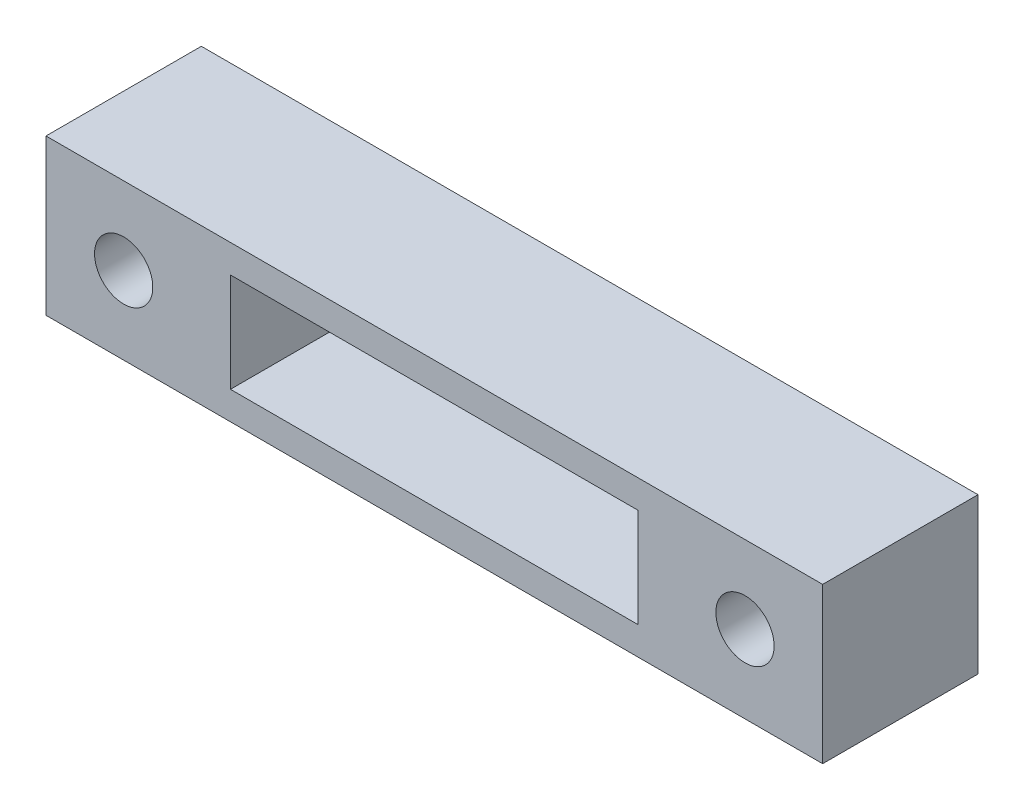
ISO-10303-21;
HEADER;
FILE_DESCRIPTION(('STEP AP214'),'2;1');
FILE_NAME('part.step','',(''),(''),'','','');
FILE_SCHEMA(('AUTOMOTIVE_DESIGN { 1 0 10303 214 1 1 1 1 }'));
ENDSEC;
DATA;
#1=APPLICATION_CONTEXT('core data for automotive mechanical design processes');
#2=APPLICATION_PROTOCOL_DEFINITION('international standard','automotive_design',2000,#1);
#3=PRODUCT_CONTEXT('',#1,'mechanical');
#4=PRODUCT('Part','Part','',(#3));
#5=PRODUCT_RELATED_PRODUCT_CATEGORY('part','',(#4));
#6=PRODUCT_DEFINITION_FORMATION('','',#4);
#7=PRODUCT_DEFINITION_CONTEXT('part definition',#1,'design');
#8=PRODUCT_DEFINITION('design','',#6,#7);
#9=PRODUCT_DEFINITION_SHAPE('','',#8);
#10=(LENGTH_UNIT() NAMED_UNIT(*) SI_UNIT(.MILLI.,.METRE.));
#11=(NAMED_UNIT(*) PLANE_ANGLE_UNIT() SI_UNIT($,.RADIAN.));
#12=(NAMED_UNIT(*) SI_UNIT($,.STERADIAN.) SOLID_ANGLE_UNIT());
#13=UNCERTAINTY_MEASURE_WITH_UNIT(LENGTH_MEASURE(1.E-05),#10,'distance_accuracy_value','');
#14=(GEOMETRIC_REPRESENTATION_CONTEXT(3) GLOBAL_UNCERTAINTY_ASSIGNED_CONTEXT((#13)) GLOBAL_UNIT_ASSIGNED_CONTEXT((#10,
#11,#12)) REPRESENTATION_CONTEXT('',''));
#15=CARTESIAN_POINT('',(0.,0.,0.));
#16=DIRECTION('',(0.,0.,1.));
#17=DIRECTION('',(1.,0.,0.));
#18=AXIS2_PLACEMENT_3D('',#15,#16,#17);
#19=CARTESIAN_POINT('',(-20.,8.,0.));
#20=DIRECTION('',(-1.,0.,0.));
#21=DIRECTION('',(0.,0.,1.));
#22=AXIS2_PLACEMENT_3D('',#19,#20,#21);
#23=PLANE('',#22);
#24=DIRECTION('',(0.,0.,-1.));
#25=VECTOR('',#24,1.);
#26=CARTESIAN_POINT('',(-20.,0.,0.));
#27=LINE('',#26,#25);
#28=CARTESIAN_POINT('',(-20.,0.,-12.));
#29=VERTEX_POINT('',#28);
#30=CARTESIAN_POINT('',(-20.,0.,-20.));
#31=VERTEX_POINT('',#30);
#32=EDGE_CURVE('E161',#29,#31,#27,.T.);
#33=ORIENTED_EDGE('',*,*,#32,.F.);
#34=DIRECTION('',(0.,-1.,0.));
#35=VECTOR('',#34,1.);
#36=CARTESIAN_POINT('',(-20.,8.,-12.));
#37=LINE('',#36,#35);
#38=CARTESIAN_POINT('',(-20.,8.,-12.));
#39=VERTEX_POINT('',#38);
#40=EDGE_CURVE('E11',#39,#29,#37,.T.);
#41=ORIENTED_EDGE('',*,*,#40,.F.);
#42=DIRECTION('',(0.,0.,-1.));
#43=VECTOR('',#42,1.);
#44=CARTESIAN_POINT('',(-20.,8.,0.));
#45=LINE('',#44,#43);
#46=CARTESIAN_POINT('',(-20.,8.,-20.));
#47=VERTEX_POINT('',#46);
#48=EDGE_CURVE('E167',#39,#47,#45,.T.);
#49=ORIENTED_EDGE('',*,*,#48,.T.);
#50=DIRECTION('',(0.,-1.,0.));
#51=VECTOR('',#50,1.);
#52=CARTESIAN_POINT('',(-20.,8.,-20.));
#53=LINE('',#52,#51);
#54=EDGE_CURVE('E69',#47,#31,#53,.T.);
#55=ORIENTED_EDGE('',*,*,#54,.T.);
#56=EDGE_LOOP('',(#33,#41,#49,#55));
#57=FACE_BOUND('',#56,.T.);
#58=ADVANCED_FACE('F45',(#57),#23,.T.);
#59=CARTESIAN_POINT('',(0.,8.,-12.));
#60=DIRECTION('',(0.,0.,-1.));
#61=DIRECTION('',(-1.,0.,0.));
#62=AXIS2_PLACEMENT_3D('',#59,#60,#61);
#63=PLANE('',#62);
#64=CARTESIAN_POINT('',(16.,4.,-12.));
#65=DIRECTION('',(0.,0.,-1.));
#66=DIRECTION('',(-1.,0.,0.));
#67=AXIS2_PLACEMENT_3D('',#64,#65,#66);
#68=CIRCLE('',#67,1.5);
#69=CARTESIAN_POINT('',(14.5,4.,-12.));
#70=VERTEX_POINT('',#69);
#71=EDGE_CURVE('E143',#70,#70,#68,.T.);
#72=ORIENTED_EDGE('',*,*,#71,.T.);
#73=EDGE_LOOP('',(#72));
#74=FACE_BOUND('',#73,.T.);
#75=CARTESIAN_POINT('',(-16.,4.,-12.));
#76=DIRECTION('',(0.,0.,-1.));
#77=DIRECTION('',(-1.,0.,0.));
#78=AXIS2_PLACEMENT_3D('',#75,#76,#77);
#79=CIRCLE('',#78,1.5);
#80=CARTESIAN_POINT('',(-17.5,4.,-12.));
#81=VERTEX_POINT('',#80);
#82=EDGE_CURVE('E260',#81,#81,#79,.T.);
#83=ORIENTED_EDGE('',*,*,#82,.T.);
#84=EDGE_LOOP('',(#83));
#85=FACE_BOUND('',#84,.T.);
#86=DIRECTION('',(0.,1.,0.));
#87=VECTOR('',#86,1.);
#88=CARTESIAN_POINT('',(10.5,1.45,-12.));
#89=LINE('',#88,#87);
#90=CARTESIAN_POINT('',(10.5,1.45,-12.));
#91=VERTEX_POINT('',#90);
#92=CARTESIAN_POINT('',(10.5,6.55,-12.));
#93=VERTEX_POINT('',#92);
#94=EDGE_CURVE('E152',#91,#93,#89,.T.);
#95=ORIENTED_EDGE('',*,*,#94,.F.);
#96=DIRECTION('',(1.,0.,0.));
#97=VECTOR('',#96,1.);
#98=CARTESIAN_POINT('',(-10.5,1.45,-12.));
#99=LINE('',#98,#97);
#100=CARTESIAN_POINT('',(-10.5,1.45,-12.));
#101=VERTEX_POINT('',#100);
#102=EDGE_CURVE('E60',#101,#91,#99,.T.);
#103=ORIENTED_EDGE('',*,*,#102,.F.);
#104=DIRECTION('',(0.,1.,0.));
#105=VECTOR('',#104,1.);
#106=CARTESIAN_POINT('',(-10.5,1.45,-12.));
#107=LINE('',#106,#105);
#108=CARTESIAN_POINT('',(-10.5,6.55,-12.));
#109=VERTEX_POINT('',#108);
#110=EDGE_CURVE('E136',#101,#109,#107,.T.);
#111=ORIENTED_EDGE('',*,*,#110,.T.);
#112=DIRECTION('',(1.,0.,0.));
#113=VECTOR('',#112,1.);
#114=CARTESIAN_POINT('',(-10.5,6.55,-12.));
#115=LINE('',#114,#113);
#116=EDGE_CURVE('E140',#109,#93,#115,.T.);
#117=ORIENTED_EDGE('',*,*,#116,.T.);
#118=EDGE_LOOP('',(#95,#103,#111,#117));
#119=FACE_BOUND('',#118,.T.);
#120=DIRECTION('',(1.,0.,0.));
#121=VECTOR('',#120,1.);
#122=CARTESIAN_POINT('',(0.,0.,-12.));
#123=LINE('',#122,#121);
#124=CARTESIAN_POINT('',(20.,0.,-12.));
#125=VERTEX_POINT('',#124);
#126=EDGE_CURVE('E182',#29,#125,#123,.T.);
#127=ORIENTED_EDGE('',*,*,#126,.T.);
#128=DIRECTION('',(0.,-1.,0.));
#129=VECTOR('',#128,1.);
#130=CARTESIAN_POINT('',(20.,8.,-12.));
#131=LINE('',#130,#129);
#132=CARTESIAN_POINT('',(20.,8.,-12.));
#133=VERTEX_POINT('',#132);
#134=EDGE_CURVE('E53',#133,#125,#131,.T.);
#135=ORIENTED_EDGE('',*,*,#134,.F.);
#136=DIRECTION('',(1.,0.,0.));
#137=VECTOR('',#136,1.);
#138=CARTESIAN_POINT('',(0.,8.,-12.));
#139=LINE('',#138,#137);
#140=EDGE_CURVE('E170',#39,#133,#139,.T.);
#141=ORIENTED_EDGE('',*,*,#140,.F.);
#142=ORIENTED_EDGE('',*,*,#40,.T.);
#143=EDGE_LOOP('',(#127,#135,#141,#142));
#144=FACE_BOUND('',#143,.T.);
#145=ADVANCED_FACE('F213',(#74,#85,#119,#144),#63,.F.);
#146=CARTESIAN_POINT('',(20.,8.,0.));
#147=DIRECTION('',(-1.,0.,0.));
#148=DIRECTION('',(0.,0.,1.));
#149=AXIS2_PLACEMENT_3D('',#146,#147,#148);
#150=PLANE('',#149);
#151=DIRECTION('',(0.,0.,-1.));
#152=VECTOR('',#151,1.);
#153=CARTESIAN_POINT('',(20.,0.,0.));
#154=LINE('',#153,#152);
#155=CARTESIAN_POINT('',(20.,0.,-20.));
#156=VERTEX_POINT('',#155);
#157=EDGE_CURVE('E185',#125,#156,#154,.T.);
#158=ORIENTED_EDGE('',*,*,#157,.T.);
#159=DIRECTION('',(0.,-1.,0.));
#160=VECTOR('',#159,1.);
#161=CARTESIAN_POINT('',(20.,8.,-20.));
#162=LINE('',#161,#160);
#163=CARTESIAN_POINT('',(20.,8.,-20.));
#164=VERTEX_POINT('',#163);
#165=EDGE_CURVE('E194',#164,#156,#162,.T.);
#166=ORIENTED_EDGE('',*,*,#165,.F.);
#167=DIRECTION('',(0.,0.,-1.));
#168=VECTOR('',#167,1.);
#169=CARTESIAN_POINT('',(20.,8.,0.));
#170=LINE('',#169,#168);
#171=EDGE_CURVE('E174',#133,#164,#170,.T.);
#172=ORIENTED_EDGE('',*,*,#171,.F.);
#173=ORIENTED_EDGE('',*,*,#134,.T.);
#174=EDGE_LOOP('',(#158,#166,#172,#173));
#175=FACE_BOUND('',#174,.T.);
#176=ADVANCED_FACE('F202',(#175),#150,.F.);
#177=CARTESIAN_POINT('',(0.,8.,-20.));
#178=DIRECTION('',(0.,0.,-1.));
#179=DIRECTION('',(-1.,0.,0.));
#180=AXIS2_PLACEMENT_3D('',#177,#178,#179);
#181=PLANE('',#180);
#182=CARTESIAN_POINT('',(16.,4.,-20.));
#183=DIRECTION('',(0.,0.,-1.));
#184=DIRECTION('',(-1.,0.,0.));
#185=AXIS2_PLACEMENT_3D('',#182,#183,#184);
#186=CIRCLE('',#185,1.5);
#187=CARTESIAN_POINT('',(14.5,4.,-20.));
#188=VERTEX_POINT('',#187);
#189=EDGE_CURVE('E257',#188,#188,#186,.T.);
#190=ORIENTED_EDGE('',*,*,#189,.F.);
#191=EDGE_LOOP('',(#190));
#192=FACE_BOUND('',#191,.T.);
#193=CARTESIAN_POINT('',(-16.,4.,-20.));
#194=DIRECTION('',(0.,0.,-1.));
#195=DIRECTION('',(1.,0.,0.));
#196=AXIS2_PLACEMENT_3D('',#193,#194,#195);
#197=CIRCLE('',#196,1.5);
#198=CARTESIAN_POINT('',(-14.5,4.,-20.));
#199=VERTEX_POINT('',#198);
#200=EDGE_CURVE('E265',#199,#199,#197,.T.);
#201=ORIENTED_EDGE('',*,*,#200,.F.);
#202=EDGE_LOOP('',(#201));
#203=FACE_BOUND('',#202,.T.);
#204=DIRECTION('',(1.,0.,0.));
#205=VECTOR('',#204,1.);
#206=CARTESIAN_POINT('',(0.,0.,-20.));
#207=LINE('',#206,#205);
#208=EDGE_CURVE('E171',#31,#156,#207,.T.);
#209=ORIENTED_EDGE('',*,*,#208,.F.);
#210=ORIENTED_EDGE('',*,*,#54,.F.);
#211=DIRECTION('',(1.,0.,0.));
#212=VECTOR('',#211,1.);
#213=CARTESIAN_POINT('',(0.,8.,-20.));
#214=LINE('',#213,#212);
#215=EDGE_CURVE('E177',#47,#164,#214,.T.);
#216=ORIENTED_EDGE('',*,*,#215,.T.);
#217=ORIENTED_EDGE('',*,*,#165,.T.);
#218=EDGE_LOOP('',(#209,#210,#216,#217));
#219=FACE_BOUND('',#218,.T.);
#220=ADVANCED_FACE('F208',(#192,#203,#219),#181,.T.);
#221=CARTESIAN_POINT('',(0.,8.,0.));
#222=DIRECTION('',(0.,1.,0.));
#223=DIRECTION('',(0.,0.,1.));
#224=AXIS2_PLACEMENT_3D('',#221,#222,#223);
#225=PLANE('',#224);
#226=ORIENTED_EDGE('',*,*,#48,.F.);
#227=ORIENTED_EDGE('',*,*,#140,.T.);
#228=ORIENTED_EDGE('',*,*,#171,.T.);
#229=ORIENTED_EDGE('',*,*,#215,.F.);
#230=EDGE_LOOP('',(#226,#227,#228,#229));
#231=FACE_BOUND('',#230,.T.);
#232=ADVANCED_FACE('F212',(#231),#225,.T.);
#233=CARTESIAN_POINT('',(0.,0.,0.));
#234=DIRECTION('',(0.,1.,0.));
#235=DIRECTION('',(0.,0.,1.));
#236=AXIS2_PLACEMENT_3D('',#233,#234,#235);
#237=PLANE('',#236);
#238=ORIENTED_EDGE('',*,*,#32,.T.);
#239=ORIENTED_EDGE('',*,*,#208,.T.);
#240=ORIENTED_EDGE('',*,*,#157,.F.);
#241=ORIENTED_EDGE('',*,*,#126,.F.);
#242=EDGE_LOOP('',(#238,#239,#240,#241));
#243=FACE_BOUND('',#242,.T.);
#244=ADVANCED_FACE('F207',(#243),#237,.F.);
#245=CARTESIAN_POINT('',(-10.5,1.45,-17.5));
#246=DIRECTION('',(0.,-1.,0.));
#247=DIRECTION('',(0.,0.,-1.));
#248=AXIS2_PLACEMENT_3D('',#245,#246,#247);
#249=PLANE('',#248);
#250=ORIENTED_EDGE('',*,*,#102,.T.);
#251=DIRECTION('',(0.,0.,1.));
#252=VECTOR('',#251,1.);
#253=CARTESIAN_POINT('',(10.5,1.45,-17.5));
#254=LINE('',#253,#252);
#255=CARTESIAN_POINT('',(10.5,1.45,-17.5));
#256=VERTEX_POINT('',#255);
#257=EDGE_CURVE('E112',#256,#91,#254,.T.);
#258=ORIENTED_EDGE('',*,*,#257,.F.);
#259=DIRECTION('',(1.,0.,0.));
#260=VECTOR('',#259,1.);
#261=CARTESIAN_POINT('',(-10.5,1.45,-17.5));
#262=LINE('',#261,#260);
#263=CARTESIAN_POINT('',(-10.5,1.45,-17.5));
#264=VERTEX_POINT('',#263);
#265=EDGE_CURVE('E116',#264,#256,#262,.T.);
#266=ORIENTED_EDGE('',*,*,#265,.F.);
#267=DIRECTION('',(0.,0.,1.));
#268=VECTOR('',#267,1.);
#269=CARTESIAN_POINT('',(-10.5,1.45,-17.5));
#270=LINE('',#269,#268);
#271=EDGE_CURVE('E158',#264,#101,#270,.T.);
#272=ORIENTED_EDGE('',*,*,#271,.T.);
#273=EDGE_LOOP('',(#250,#258,#266,#272));
#274=FACE_BOUND('',#273,.T.);
#275=ADVANCED_FACE('F114',(#274),#249,.F.);
#276=CARTESIAN_POINT('',(-10.5,1.45,-17.5));
#277=DIRECTION('',(1.,0.,0.));
#278=DIRECTION('',(0.,0.,-1.));
#279=AXIS2_PLACEMENT_3D('',#276,#277,#278);
#280=PLANE('',#279);
#281=ORIENTED_EDGE('',*,*,#110,.F.);
#282=ORIENTED_EDGE('',*,*,#271,.F.);
#283=DIRECTION('',(0.,1.,0.));
#284=VECTOR('',#283,1.);
#285=CARTESIAN_POINT('',(-10.5,1.45,-17.5));
#286=LINE('',#285,#284);
#287=CARTESIAN_POINT('',(-10.5,6.55,-17.5));
#288=VERTEX_POINT('',#287);
#289=EDGE_CURVE('E122',#264,#288,#286,.T.);
#290=ORIENTED_EDGE('',*,*,#289,.T.);
#291=DIRECTION('',(0.,0.,1.));
#292=VECTOR('',#291,1.);
#293=CARTESIAN_POINT('',(-10.5,6.55,-17.5));
#294=LINE('',#293,#292);
#295=EDGE_CURVE('E162',#288,#109,#294,.T.);
#296=ORIENTED_EDGE('',*,*,#295,.T.);
#297=EDGE_LOOP('',(#281,#282,#290,#296));
#298=FACE_BOUND('',#297,.T.);
#299=ADVANCED_FACE('F234',(#298),#280,.T.);
#300=CARTESIAN_POINT('',(-10.5,6.55,-17.5));
#301=DIRECTION('',(0.,-1.,0.));
#302=DIRECTION('',(0.,0.,-1.));
#303=AXIS2_PLACEMENT_3D('',#300,#301,#302);
#304=PLANE('',#303);
#305=ORIENTED_EDGE('',*,*,#116,.F.);
#306=ORIENTED_EDGE('',*,*,#295,.F.);
#307=DIRECTION('',(1.,0.,0.));
#308=VECTOR('',#307,1.);
#309=CARTESIAN_POINT('',(-10.5,6.55,-17.5));
#310=LINE('',#309,#308);
#311=CARTESIAN_POINT('',(10.5,6.55,-17.5));
#312=VERTEX_POINT('',#311);
#313=EDGE_CURVE('E131',#288,#312,#310,.T.);
#314=ORIENTED_EDGE('',*,*,#313,.T.);
#315=DIRECTION('',(0.,0.,1.));
#316=VECTOR('',#315,1.);
#317=CARTESIAN_POINT('',(10.5,6.55,-17.5));
#318=LINE('',#317,#316);
#319=EDGE_CURVE('E121',#312,#93,#318,.T.);
#320=ORIENTED_EDGE('',*,*,#319,.T.);
#321=EDGE_LOOP('',(#305,#306,#314,#320));
#322=FACE_BOUND('',#321,.T.);
#323=ADVANCED_FACE('F237',(#322),#304,.T.);
#324=CARTESIAN_POINT('',(10.5,1.45,-17.5));
#325=DIRECTION('',(1.,0.,0.));
#326=DIRECTION('',(0.,0.,-1.));
#327=AXIS2_PLACEMENT_3D('',#324,#325,#326);
#328=PLANE('',#327);
#329=ORIENTED_EDGE('',*,*,#94,.T.);
#330=ORIENTED_EDGE('',*,*,#319,.F.);
#331=DIRECTION('',(0.,1.,0.));
#332=VECTOR('',#331,1.);
#333=CARTESIAN_POINT('',(10.5,1.45,-17.5));
#334=LINE('',#333,#332);
#335=EDGE_CURVE('E126',#256,#312,#334,.T.);
#336=ORIENTED_EDGE('',*,*,#335,.F.);
#337=ORIENTED_EDGE('',*,*,#257,.T.);
#338=EDGE_LOOP('',(#329,#330,#336,#337));
#339=FACE_BOUND('',#338,.T.);
#340=ADVANCED_FACE('F127',(#339),#328,.F.);
#341=CARTESIAN_POINT('',(0.,0.,-17.5));
#342=DIRECTION('',(0.,0.,1.));
#343=DIRECTION('',(1.,0.,0.));
#344=AXIS2_PLACEMENT_3D('',#341,#342,#343);
#345=PLANE('',#344);
#346=ORIENTED_EDGE('',*,*,#265,.T.);
#347=ORIENTED_EDGE('',*,*,#335,.T.);
#348=ORIENTED_EDGE('',*,*,#313,.F.);
#349=ORIENTED_EDGE('',*,*,#289,.F.);
#350=EDGE_LOOP('',(#346,#347,#348,#349));
#351=FACE_BOUND('',#350,.T.);
#352=ADVANCED_FACE('F134',(#351),#345,.T.);
#353=CARTESIAN_POINT('',(-16.,4.,-10.));
#354=DIRECTION('',(0.,0.,-1.));
#355=DIRECTION('',(-1.,0.,0.));
#356=AXIS2_PLACEMENT_3D('',#353,#354,#355);
#357=CYLINDRICAL_SURFACE('',#356,1.5);
#358=ORIENTED_EDGE('',*,*,#200,.T.);
#359=EDGE_LOOP('',(#358));
#360=FACE_BOUND('',#359,.T.);
#361=ORIENTED_EDGE('',*,*,#82,.F.);
#362=EDGE_LOOP('',(#361));
#363=FACE_BOUND('',#362,.T.);
#364=ADVANCED_FACE('F245',(#360,#363),#357,.F.);
#365=CARTESIAN_POINT('',(16.,4.,-10.));
#366=DIRECTION('',(0.,0.,-1.));
#367=DIRECTION('',(-1.,0.,0.));
#368=AXIS2_PLACEMENT_3D('',#365,#366,#367);
#369=CYLINDRICAL_SURFACE('',#368,1.5);
#370=ORIENTED_EDGE('',*,*,#189,.T.);
#371=EDGE_LOOP('',(#370));
#372=FACE_BOUND('',#371,.T.);
#373=ORIENTED_EDGE('',*,*,#71,.F.);
#374=EDGE_LOOP('',(#373));
#375=FACE_BOUND('',#374,.T.);
#376=ADVANCED_FACE('F248',(#372,#375),#369,.F.);
#377=CLOSED_SHELL('',(#58,#145,#176,#220,#232,#244,#275,#299,#323,#340,#352,#364,#376));
#378=MANIFOLD_SOLID_BREP('B2',#377);
#379=ADVANCED_BREP_SHAPE_REPRESENTATION('',(#18,#378),#14);
#380=SHAPE_DEFINITION_REPRESENTATION(#9,#379);
ENDSEC;
END-ISO-10303-21;
